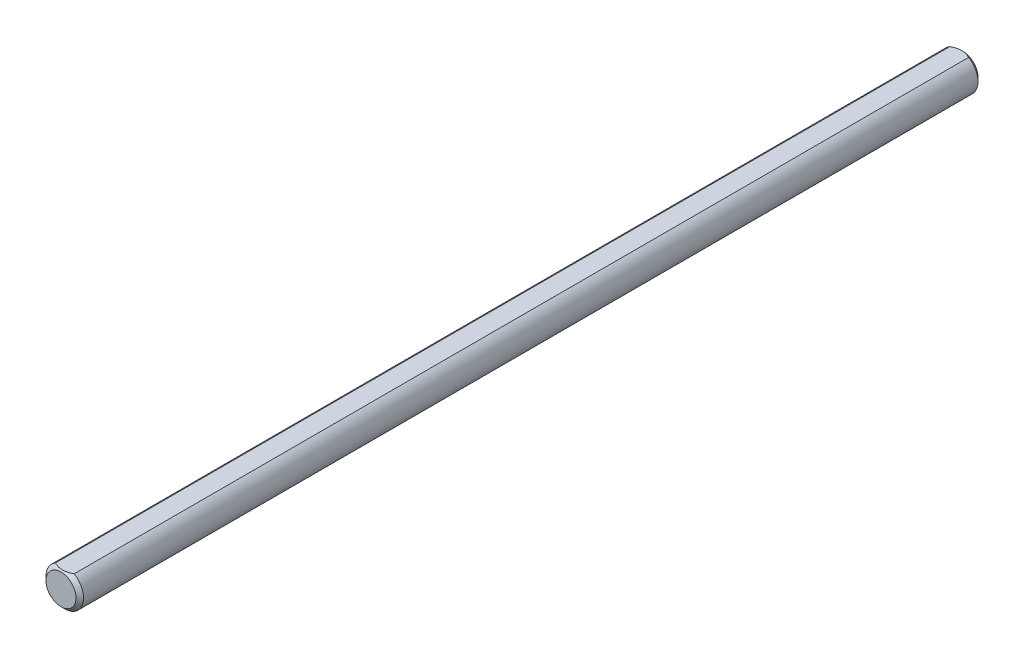
ISO-10303-21;
HEADER;
FILE_DESCRIPTION(('STEP AP214'),'2;1');
FILE_NAME('part.step','',(''),(''),'','','');
FILE_SCHEMA(('AUTOMOTIVE_DESIGN { 1 0 10303 214 1 1 1 1 }'));
ENDSEC;
DATA;
#1=APPLICATION_CONTEXT('core data for automotive mechanical design processes');
#2=APPLICATION_PROTOCOL_DEFINITION('international standard','automotive_design',2000,#1);
#3=PRODUCT_CONTEXT('',#1,'mechanical');
#4=PRODUCT('Part','Part','',(#3));
#5=PRODUCT_RELATED_PRODUCT_CATEGORY('part','',(#4));
#6=PRODUCT_DEFINITION_FORMATION('','',#4);
#7=PRODUCT_DEFINITION_CONTEXT('part definition',#1,'design');
#8=PRODUCT_DEFINITION('design','',#6,#7);
#9=PRODUCT_DEFINITION_SHAPE('','',#8);
#10=(LENGTH_UNIT() NAMED_UNIT(*) SI_UNIT(.MILLI.,.METRE.));
#11=(NAMED_UNIT(*) PLANE_ANGLE_UNIT() SI_UNIT($,.RADIAN.));
#12=(NAMED_UNIT(*) SI_UNIT($,.STERADIAN.) SOLID_ANGLE_UNIT());
#13=UNCERTAINTY_MEASURE_WITH_UNIT(LENGTH_MEASURE(1.E-05),#10,'distance_accuracy_value','');
#14=(GEOMETRIC_REPRESENTATION_CONTEXT(3) GLOBAL_UNCERTAINTY_ASSIGNED_CONTEXT((#13)) GLOBAL_UNIT_ASSIGNED_CONTEXT((#10,
#11,#12)) REPRESENTATION_CONTEXT('',''));
#15=CARTESIAN_POINT('',(0.,0.,0.));
#16=DIRECTION('',(0.,0.,1.));
#17=DIRECTION('',(1.,0.,0.));
#18=AXIS2_PLACEMENT_3D('',#15,#16,#17);
#19=CARTESIAN_POINT('',(0.,0.,152.4));
#20=DIRECTION('',(0.,0.,-1.));
#21=DIRECTION('',(-1.,0.,0.));
#22=AXIS2_PLACEMENT_3D('',#19,#20,#21);
#23=CYLINDRICAL_SURFACE('',#22,6.35);
#24=CARTESIAN_POINT('',(0.,0.,151.13));
#25=DIRECTION('',(0.,0.,1.));
#26=DIRECTION('',(1.,0.,0.));
#27=AXIS2_PLACEMENT_3D('',#24,#25,#26);
#28=CIRCLE('',#27,6.35);
#29=CARTESIAN_POINT('',(3.175,5.49926131403118,151.13));
#30=VERTEX_POINT('',#29);
#31=CARTESIAN_POINT('',(-3.175,5.49926131403118,151.13));
#32=VERTEX_POINT('',#31);
#33=EDGE_CURVE('E73',#30,#32,#28,.F.);
#34=ORIENTED_EDGE('',*,*,#33,.T.);
#35=DIRECTION('',(0.,0.,1.));
#36=VECTOR('',#35,1.);
#37=CARTESIAN_POINT('',(-3.175,5.49926131403118,-152.4));
#38=LINE('',#37,#36);
#39=CARTESIAN_POINT('',(-3.175,5.49926131403118,-151.13));
#40=VERTEX_POINT('',#39);
#41=EDGE_CURVE('E51',#40,#32,#38,.T.);
#42=ORIENTED_EDGE('',*,*,#41,.F.);
#43=CARTESIAN_POINT('',(0.,0.,-151.13));
#44=DIRECTION('',(0.,0.,1.));
#45=DIRECTION('',(1.,0.,0.));
#46=AXIS2_PLACEMENT_3D('',#43,#44,#45);
#47=CIRCLE('',#46,6.35);
#48=CARTESIAN_POINT('',(3.175,5.49926131403118,-151.13));
#49=VERTEX_POINT('',#48);
#50=EDGE_CURVE('E72',#40,#49,#47,.T.);
#51=ORIENTED_EDGE('',*,*,#50,.T.);
#52=DIRECTION('',(0.,0.,1.));
#53=VECTOR('',#52,1.);
#54=CARTESIAN_POINT('',(3.175,5.49926131403118,-152.4));
#55=LINE('',#54,#53);
#56=EDGE_CURVE('E61',#49,#30,#55,.T.);
#57=ORIENTED_EDGE('',*,*,#56,.T.);
#58=EDGE_LOOP('',(#34,#42,#51,#57));
#59=FACE_BOUND('',#58,.T.);
#60=ADVANCED_FACE('F32',(#59),#23,.T.);
#61=CARTESIAN_POINT('',(0.,0.,152.4));
#62=DIRECTION('',(0.,0.,1.));
#63=DIRECTION('',(1.,0.,0.));
#64=AXIS2_PLACEMENT_3D('',#61,#62,#63);
#65=PLANE('',#64);
#66=CARTESIAN_POINT('',(0.,0.,152.4));
#67=DIRECTION('',(0.,0.,1.));
#68=DIRECTION('',(1.,0.,0.));
#69=AXIS2_PLACEMENT_3D('',#66,#67,#68);
#70=CIRCLE('',#69,5.08000000000017);
#71=CARTESIAN_POINT('',(5.08000000000017,0.,152.4));
#72=VERTEX_POINT('',#71);
#73=EDGE_CURVE('E45',#72,#72,#70,.T.);
#74=ORIENTED_EDGE('',*,*,#73,.T.);
#75=EDGE_LOOP('',(#74));
#76=FACE_BOUND('',#75,.T.);
#77=ADVANCED_FACE('F83',(#76),#65,.T.);
#78=CARTESIAN_POINT('',(0.,0.,-152.4));
#79=DIRECTION('',(0.,0.,1.));
#80=DIRECTION('',(1.,0.,0.));
#81=AXIS2_PLACEMENT_3D('',#78,#79,#80);
#82=PLANE('',#81);
#83=CARTESIAN_POINT('',(0.,0.,-152.4));
#84=DIRECTION('',(0.,0.,1.));
#85=DIRECTION('',(1.,0.,0.));
#86=AXIS2_PLACEMENT_3D('',#83,#84,#85);
#87=CIRCLE('',#86,5.07999999999975);
#88=CARTESIAN_POINT('',(5.07999999999975,0.,-152.4));
#89=VERTEX_POINT('',#88);
#90=EDGE_CURVE('E75',#89,#89,#87,.F.);
#91=ORIENTED_EDGE('',*,*,#90,.T.);
#92=EDGE_LOOP('',(#91));
#93=FACE_BOUND('',#92,.T.);
#94=ADVANCED_FACE('F91',(#93),#82,.F.);
#95=CARTESIAN_POINT('',(0.,0.,-151.13));
#96=DIRECTION('',(0.,0.,1.));
#97=DIRECTION('',(1.,0.,0.));
#98=AXIS2_PLACEMENT_3D('',#95,#96,#97);
#99=CONICAL_SURFACE('',#98,6.35,0.78539816339744);
#100=CARTESIAN_POINT('',(-6.45792270447447,5.49926131403118,-148.997863437967));
#101=CARTESIAN_POINT('',(-6.30123299115938,5.49926131403118,-149.11713304882));
#102=CARTESIAN_POINT('',(-6.14368019310386,5.49926131403118,-149.235286963914));
#103=CARTESIAN_POINT('',(-5.82650261129752,5.49926131403118,-149.468859435372));
#104=CARTESIAN_POINT('',(-5.66687732996829,5.49926131403118,-149.584277315324));
#105=CARTESIAN_POINT('',(-5.34404125721352,5.49926131403118,-149.812695095336));
#106=CARTESIAN_POINT('',(-5.18081227996579,5.49926131403118,-149.925669378111));
#107=CARTESIAN_POINT('',(-4.85160623188589,5.49926131403118,-150.147527029631));
#108=CARTESIAN_POINT('',(-4.68562935411623,5.49926131403118,-150.256410684034));
#109=CARTESIAN_POINT('',(-4.3404550491742,5.49926131403118,-150.475531175533));
#110=CARTESIAN_POINT('',(-4.1610606888906,5.49926131403118,-150.585459356919));
#111=CARTESIAN_POINT('',(-3.79807203814187,5.49926131403118,-150.798263768952));
#112=CARTESIAN_POINT('',(-3.61447707081215,5.49926131403118,-150.901138852273));
#113=CARTESIAN_POINT('',(-3.24307520421851,5.49926131403118,-151.097629609329));
#114=CARTESIAN_POINT('',(-3.05528281776385,5.49926131403118,-151.191272500099));
#115=CARTESIAN_POINT('',(-2.67449413212759,5.49926131403118,-151.367201630935));
#116=CARTESIAN_POINT('',(-2.48150028183897,5.49926131403118,-151.449493107432));
#117=CARTESIAN_POINT('',(-2.1072948555933,5.49926131403118,-151.593112874239));
#118=CARTESIAN_POINT('',(-1.92655285319337,5.49926131403118,-151.655652087309));
#119=CARTESIAN_POINT('',(-1.56060746830592,5.49926131403118,-151.766246375338));
#120=CARTESIAN_POINT('',(-1.375403789872,5.49926131403118,-151.814300486616));
#121=CARTESIAN_POINT('',(-1.00478287011043,5.49926131403118,-151.892576579398));
#122=CARTESIAN_POINT('',(-0.819432918251043,5.49926131403118,-151.923111901061));
#123=CARTESIAN_POINT('',(-0.446612633418211,5.49926131403118,-151.965737692493));
#124=CARTESIAN_POINT('',(-0.259142702617805,5.49926131403118,-151.977831603482));
#125=CARTESIAN_POINT('',(0.108671411643332,5.49926131403118,-151.982618940279));
#126=CARTESIAN_POINT('',(0.289006118135199,5.49926131403118,-151.976056061745));
#127=CARTESIAN_POINT('',(0.648191454151009,5.49926131403118,-151.945563654648));
#128=CARTESIAN_POINT('',(0.827041941701039,5.49926131403118,-151.921632483644));
#129=CARTESIAN_POINT('',(1.1849907398641,5.49926131403118,-151.857322627067));
#130=CARTESIAN_POINT('',(1.36403711675346,5.49926131403118,-151.816659580106));
#131=CARTESIAN_POINT('',(1.7182119855532,5.49926131403118,-151.721091976038));
#132=CARTESIAN_POINT('',(1.89334075993962,5.49926131403118,-151.666188449348));
#133=CARTESIAN_POINT('',(2.25274796244945,5.49926131403118,-151.539774305195));
#134=CARTESIAN_POINT('',(2.43668654317972,5.49926131403118,-151.467307720641));
#135=CARTESIAN_POINT('',(2.79980826463374,5.49926131403118,-151.311215445496));
#136=CARTESIAN_POINT('',(2.97898917705058,5.49926131403118,-151.227584632808));
#137=CARTESIAN_POINT('',(3.33345739278357,5.49926131403118,-151.051150388819));
#138=CARTESIAN_POINT('',(3.50873036744874,5.49926131403118,-150.958318402776));
#139=CARTESIAN_POINT('',(3.85525100497085,5.49926131403118,-150.765529526063));
#140=CARTESIAN_POINT('',(4.02649929298654,5.49926131403118,-150.665573751795));
#141=CARTESIAN_POINT('',(4.35709979473892,5.49926131403118,-150.465030445106));
#142=CARTESIAN_POINT('',(4.51662089765082,5.49926131403118,-150.364719860577));
#143=CARTESIAN_POINT('',(4.83292342020396,5.49926131403118,-150.159855692971));
#144=CARTESIAN_POINT('',(4.98970463197477,5.49926131403118,-150.055301789945));
#145=CARTESIAN_POINT('',(5.29961944937056,5.49926131403118,-149.843566459818));
#146=CARTESIAN_POINT('',(5.45277229179845,5.49926131403118,-149.736413088387));
#147=CARTESIAN_POINT('',(5.75698104722301,5.49926131403118,-149.519254075223));
#148=CARTESIAN_POINT('',(5.90803752602403,5.49926131403118,-149.409249227026));
#149=CARTESIAN_POINT('',(6.05821541939228,5.49926131403118,-149.298077911165));
#150=B_SPLINE_CURVE_WITH_KNOTS('',3,(#100,#101,#102,#103,#104,#105,#106,#107,#108,#109,#110,
#111,#112,#113,#114,#115,#116,#117,#118,#119,#120,#121,#122,#123,#124,#125,#126,#127,#128,#129,
#130,#131,#132,#133,#134,#135,#136,#137,#138,#139,#140,#141,#142,#143,#144,#145,#146,#147,#148,
#149),.UNSPECIFIED.,.F.,.F.,(4,2,2,2,2,2,2,2,2,2,2,2,2,2,2,2,2,2,2,2,2,2,2,2,4),(0.,
0.590766898542396,1.18167835699754,1.77716174324587,2.37260346798134,3.00366300190782,
3.63482494787112,4.2640667608806,4.89301732566767,5.46628528877684,6.03959138246078,
6.60229516021659,7.16489392302461,7.70538452085394,8.24592623712782,8.79606110707201,
9.34615618122147,9.93879417089731,10.53170500066,11.1265171776384,11.7212363428689,
12.2864740480171,12.851754452138,13.4124674788018,13.9730261057447),.UNSPECIFIED.);
#151=EDGE_CURVE('E56',#49,#40,#150,.F.);
#152=ORIENTED_EDGE('',*,*,#151,.F.);
#153=ORIENTED_EDGE('',*,*,#50,.F.);
#154=EDGE_LOOP('',(#152,#153));
#155=FACE_BOUND('',#154,.T.);
#156=ORIENTED_EDGE('',*,*,#90,.F.);
#157=EDGE_LOOP('',(#156));
#158=FACE_BOUND('',#157,.T.);
#159=ADVANCED_FACE('F70',(#155,#158),#99,.T.);
#160=CARTESIAN_POINT('',(0.,0.,152.4));
#161=DIRECTION('',(0.,0.,-1.));
#162=DIRECTION('',(-1.,0.,0.));
#163=AXIS2_PLACEMENT_3D('',#160,#161,#162);
#164=CONICAL_SURFACE('',#163,5.08000000000017,0.785398163397451);
#165=CARTESIAN_POINT('',(-6.45792270447468,5.49926131403118,148.997863437968));
#166=CARTESIAN_POINT('',(-6.30123299115958,5.49926131403118,149.11713304882));
#167=CARTESIAN_POINT('',(-6.14368019310405,5.49926131403118,149.235286963914));
#168=CARTESIAN_POINT('',(-5.82650261129771,5.49926131403118,149.468859435373));
#169=CARTESIAN_POINT('',(-5.66687732996848,5.49926131403118,149.584277315324));
#170=CARTESIAN_POINT('',(-5.34404125721369,5.49926131403118,149.812695095336));
#171=CARTESIAN_POINT('',(-5.18081227996594,5.49926131403118,149.925669378112));
#172=CARTESIAN_POINT('',(-4.85160623188604,5.49926131403118,150.147527029632));
#173=CARTESIAN_POINT('',(-4.68562935411638,5.49926131403118,150.256410684034));
#174=CARTESIAN_POINT('',(-4.34045504917435,5.49926131403118,150.475531175533));
#175=CARTESIAN_POINT('',(-4.16106068889073,5.49926131403118,150.585459356919));
#176=CARTESIAN_POINT('',(-3.79807203814199,5.49926131403118,150.798263768952));
#177=CARTESIAN_POINT('',(-3.61447707081226,5.49926131403118,150.901138852273));
#178=CARTESIAN_POINT('',(-3.24307520421861,5.49926131403118,151.09762960933));
#179=CARTESIAN_POINT('',(-3.05528281776394,5.49926131403118,151.191272500099));
#180=CARTESIAN_POINT('',(-2.67449413212767,5.49926131403118,151.367201630936));
#181=CARTESIAN_POINT('',(-2.48150028183905,5.49926131403118,151.449493107432));
#182=CARTESIAN_POINT('',(-2.10729485559337,5.49926131403118,151.593112874239));
#183=CARTESIAN_POINT('',(-1.92655285319343,5.49926131403118,151.65565208731));
#184=CARTESIAN_POINT('',(-1.56060746830596,5.49926131403118,151.766246375338));
#185=CARTESIAN_POINT('',(-1.37540378987204,5.49926131403118,151.814300486616));
#186=CARTESIAN_POINT('',(-1.00478287011046,5.49926131403118,151.892576579399));
#187=CARTESIAN_POINT('',(-0.819432918251062,5.49926131403118,151.923111901062));
#188=CARTESIAN_POINT('',(-0.446612633418211,5.49926131403118,151.965737692494));
#189=CARTESIAN_POINT('',(-0.259142702617799,5.49926131403118,151.977831603482));
#190=CARTESIAN_POINT('',(0.108671411643352,5.49926131403118,151.98261894028));
#191=CARTESIAN_POINT('',(0.289006118135225,5.49926131403118,151.976056061745));
#192=CARTESIAN_POINT('',(0.648191454151048,5.49926131403118,151.945563654649));
#193=CARTESIAN_POINT('',(0.827041941701084,5.49926131403118,151.921632483645));
#194=CARTESIAN_POINT('',(1.18499073986415,5.49926131403118,151.857322627067));
#195=CARTESIAN_POINT('',(1.36403711675352,5.49926131403118,151.816659580106));
#196=CARTESIAN_POINT('',(1.71821198555327,5.49926131403118,151.721091976038));
#197=CARTESIAN_POINT('',(1.89334075993969,5.49926131403118,151.666188449349));
#198=CARTESIAN_POINT('',(2.25274796244953,5.49926131403118,151.539774305195));
#199=CARTESIAN_POINT('',(2.43668654317981,5.49926131403118,151.467307720642));
#200=CARTESIAN_POINT('',(2.79980826463386,5.49926131403118,151.311215445496));
#201=CARTESIAN_POINT('',(2.97898917705072,5.49926131403118,151.227584632808));
#202=CARTESIAN_POINT('',(3.33345739278373,5.49926131403118,151.051150388819));
#203=CARTESIAN_POINT('',(3.50873036744891,5.49926131403118,150.958318402777));
#204=CARTESIAN_POINT('',(3.85525100497103,5.49926131403118,150.765529526063));
#205=CARTESIAN_POINT('',(4.02649929298672,5.49926131403118,150.665573751796));
#206=CARTESIAN_POINT('',(4.35709979473913,5.49926131403118,150.465030445106));
#207=CARTESIAN_POINT('',(4.51662089765104,5.49926131403118,150.364719860577));
#208=CARTESIAN_POINT('',(4.83292342020419,5.49926131403118,150.159855692972));
#209=CARTESIAN_POINT('',(4.98970463197501,5.49926131403118,150.055301789945));
#210=CARTESIAN_POINT('',(5.29961944937081,5.49926131403118,149.843566459819));
#211=CARTESIAN_POINT('',(5.45277229179871,5.49926131403118,149.736413088387));
#212=CARTESIAN_POINT('',(5.75698104722329,5.49926131403118,149.519254075223));
#213=CARTESIAN_POINT('',(5.90803752602432,5.49926131403118,149.409249227026));
#214=CARTESIAN_POINT('',(6.05821541939257,5.49926131403118,149.298077911165));
#215=B_SPLINE_CURVE_WITH_KNOTS('',3,(#165,#166,#167,#168,#169,#170,#171,#172,#173,#174,#175,
#176,#177,#178,#179,#180,#181,#182,#183,#184,#185,#186,#187,#188,#189,#190,#191,#192,#193,#194,
#195,#196,#197,#198,#199,#200,#201,#202,#203,#204,#205,#206,#207,#208,#209,#210,#211,#212,#213,
#214),.UNSPECIFIED.,.F.,.F.,(4,2,2,2,2,2,2,2,2,2,2,2,2,2,2,2,2,2,2,2,2,2,2,2,4),(0.,
0.590766898542409,1.18167835699759,1.77716174324594,2.37260346798142,3.00366300190792,
3.63482494787123,4.26406676088075,4.89301732566782,5.46628528877702,6.03959138246098,
6.60229516021682,7.16489392302485,7.70538452085421,8.2459262371281,8.7960611070723,
9.34615618122178,9.93879417089765,10.5317050006604,11.1265171776388,11.7212363428693,
12.2864740480176,12.8517544521385,13.4124674788024,13.9730261057453),.UNSPECIFIED.);
#216=EDGE_CURVE('E11',#32,#30,#215,.T.);
#217=ORIENTED_EDGE('',*,*,#216,.F.);
#218=ORIENTED_EDGE('',*,*,#33,.F.);
#219=EDGE_LOOP('',(#217,#218));
#220=FACE_BOUND('',#219,.T.);
#221=ORIENTED_EDGE('',*,*,#73,.F.);
#222=EDGE_LOOP('',(#221));
#223=FACE_BOUND('',#222,.T.);
#224=ADVANCED_FACE('F34',(#220,#223),#164,.T.);
#225=CARTESIAN_POINT('',(-3.175,5.49926131403118,-152.4));
#226=DIRECTION('',(0.,-1.,0.));
#227=DIRECTION('',(0.,0.,-1.));
#228=AXIS2_PLACEMENT_3D('',#225,#226,#227);
#229=PLANE('',#228);
#230=ORIENTED_EDGE('',*,*,#151,.T.);
#231=ORIENTED_EDGE('',*,*,#41,.T.);
#232=ORIENTED_EDGE('',*,*,#216,.T.);
#233=ORIENTED_EDGE('',*,*,#56,.F.);
#234=EDGE_LOOP('',(#230,#231,#232,#233));
#235=FACE_BOUND('',#234,.T.);
#236=ADVANCED_FACE('F62',(#235),#229,.F.);
#237=CLOSED_SHELL('',(#60,#77,#94,#159,#224,#236));
#238=MANIFOLD_SOLID_BREP('B2',#237);
#239=ADVANCED_BREP_SHAPE_REPRESENTATION('',(#18,#238),#14);
#240=SHAPE_DEFINITION_REPRESENTATION(#9,#239);
ENDSEC;
END-ISO-10303-21;
